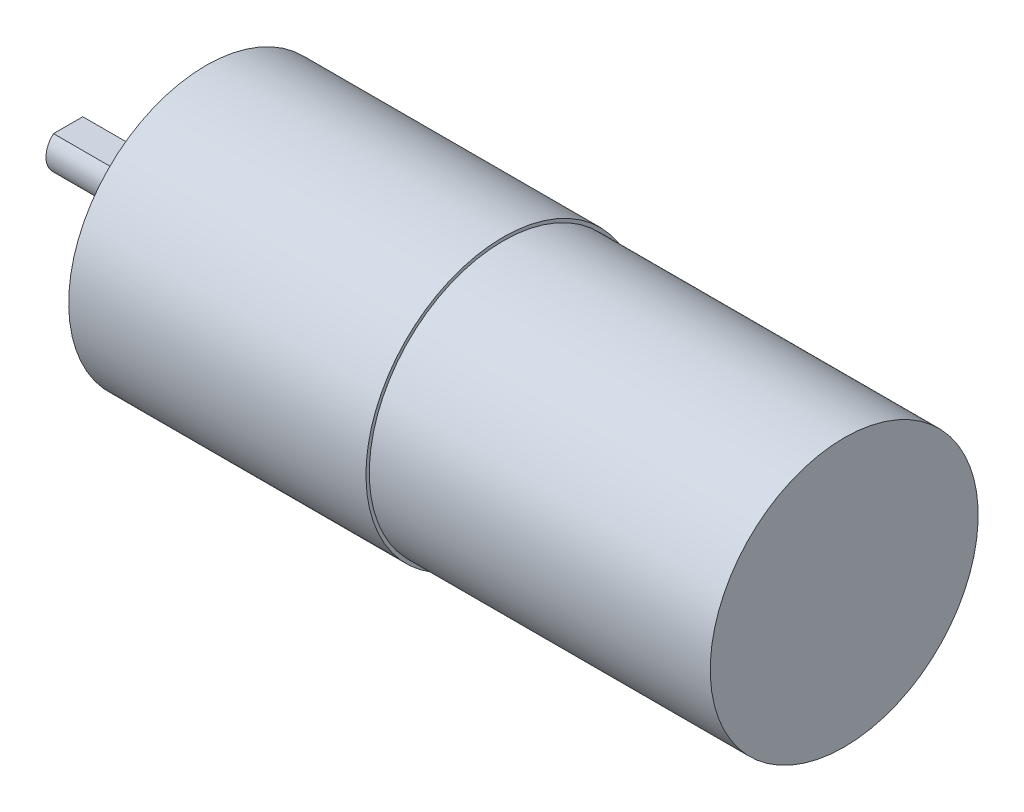
ISO-10303-21;
HEADER;
FILE_DESCRIPTION(('STEP AP214'),'2;1');
FILE_NAME('part.step','',(''),(''),'','','');
FILE_SCHEMA(('AUTOMOTIVE_DESIGN { 1 0 10303 214 1 1 1 1 }'));
ENDSEC;
DATA;
#1=APPLICATION_CONTEXT('core data for automotive mechanical design processes');
#2=APPLICATION_PROTOCOL_DEFINITION('international standard','automotive_design',2000,#1);
#3=PRODUCT_CONTEXT('',#1,'mechanical');
#4=PRODUCT('Part','Part','',(#3));
#5=PRODUCT_RELATED_PRODUCT_CATEGORY('part','',(#4));
#6=PRODUCT_DEFINITION_FORMATION('','',#4);
#7=PRODUCT_DEFINITION_CONTEXT('part definition',#1,'design');
#8=PRODUCT_DEFINITION('design','',#6,#7);
#9=PRODUCT_DEFINITION_SHAPE('','',#8);
#10=(LENGTH_UNIT() NAMED_UNIT(*) SI_UNIT(.MILLI.,.METRE.));
#11=(NAMED_UNIT(*) PLANE_ANGLE_UNIT() SI_UNIT($,.RADIAN.));
#12=(NAMED_UNIT(*) SI_UNIT($,.STERADIAN.) SOLID_ANGLE_UNIT());
#13=UNCERTAINTY_MEASURE_WITH_UNIT(LENGTH_MEASURE(1.E-05),#10,'distance_accuracy_value','');
#14=(GEOMETRIC_REPRESENTATION_CONTEXT(3) GLOBAL_UNCERTAINTY_ASSIGNED_CONTEXT((#13)) GLOBAL_UNIT_ASSIGNED_CONTEXT((#10,
#11,#12)) REPRESENTATION_CONTEXT('',''));
#15=CARTESIAN_POINT('',(0.,0.,0.));
#16=DIRECTION('',(0.,0.,1.));
#17=DIRECTION('',(1.,0.,0.));
#18=AXIS2_PLACEMENT_3D('',#15,#16,#17);
#19=CARTESIAN_POINT('',(-54.7,0.,0.));
#20=DIRECTION('',(-1.,0.,0.));
#21=DIRECTION('',(0.,-1.,0.));
#22=AXIS2_PLACEMENT_3D('',#19,#20,#21);
#23=PLANE('',#22);
#24=DIRECTION('',(0.,0.,1.));
#25=VECTOR('',#24,1.);
#26=CARTESIAN_POINT('',(-54.7,1.5,-1.3228756555323));
#27=LINE('',#26,#25);
#28=CARTESIAN_POINT('',(-54.7,1.5,-1.3228756555323));
#29=VERTEX_POINT('',#28);
#30=CARTESIAN_POINT('',(-54.7,1.5,1.3228756555323));
#31=VERTEX_POINT('',#30);
#32=EDGE_CURVE('E62',#29,#31,#27,.T.);
#33=ORIENTED_EDGE('',*,*,#32,.F.);
#34=CARTESIAN_POINT('',(-54.7,0.,0.));
#35=DIRECTION('',(1.,0.,0.));
#36=DIRECTION('',(0.,1.,0.));
#37=AXIS2_PLACEMENT_3D('',#34,#35,#36);
#38=CIRCLE('',#37,2.);
#39=EDGE_CURVE('E11',#31,#29,#38,.T.);
#40=ORIENTED_EDGE('',*,*,#39,.F.);
#41=EDGE_LOOP('',(#33,#40));
#42=FACE_BOUND('',#41,.T.);
#43=ADVANCED_FACE('F34',(#42),#23,.T.);
#44=CARTESIAN_POINT('',(-28.825,0.,0.));
#45=DIRECTION('',(1.,0.,0.));
#46=DIRECTION('',(0.,1.,0.));
#47=AXIS2_PLACEMENT_3D('',#44,#45,#46);
#48=CYLINDRICAL_SURFACE('',#47,2.);
#49=DIRECTION('',(-1.,0.,0.));
#50=VECTOR('',#49,1.);
#51=CARTESIAN_POINT('',(-46.7,1.5,-1.3228756555323));
#52=LINE('',#51,#50);
#53=CARTESIAN_POINT('',(-46.7,1.5,-1.3228756555323));
#54=VERTEX_POINT('',#53);
#55=EDGE_CURVE('E59',#54,#29,#52,.T.);
#56=ORIENTED_EDGE('',*,*,#55,.F.);
#57=CARTESIAN_POINT('',(-46.7,0.,0.));
#58=DIRECTION('',(-1.,0.,0.));
#59=DIRECTION('',(0.,-1.,0.));
#60=AXIS2_PLACEMENT_3D('',#57,#58,#59);
#61=CIRCLE('',#60,2.);
#62=CARTESIAN_POINT('',(-46.7,1.5,1.3228756555323));
#63=VERTEX_POINT('',#62);
#64=EDGE_CURVE('E52',#63,#54,#61,.T.);
#65=ORIENTED_EDGE('',*,*,#64,.F.);
#66=DIRECTION('',(-1.,0.,0.));
#67=VECTOR('',#66,1.);
#68=CARTESIAN_POINT('',(-46.7,1.5,1.3228756555323));
#69=LINE('',#68,#67);
#70=EDGE_CURVE('E65',#63,#31,#69,.T.);
#71=ORIENTED_EDGE('',*,*,#70,.T.);
#72=ORIENTED_EDGE('',*,*,#39,.T.);
#73=EDGE_LOOP('',(#56,#65,#71,#72));
#74=FACE_BOUND('',#73,.T.);
#75=CARTESIAN_POINT('',(-44.8,0.,0.));
#76=DIRECTION('',(1.,0.,0.));
#77=DIRECTION('',(0.,1.,0.));
#78=AXIS2_PLACEMENT_3D('',#75,#76,#77);
#79=CIRCLE('',#78,2.);
#80=CARTESIAN_POINT('',(-44.8,2.,0.));
#81=VERTEX_POINT('',#80);
#82=EDGE_CURVE('E41',#81,#81,#79,.T.);
#83=ORIENTED_EDGE('',*,*,#82,.F.);
#84=EDGE_LOOP('',(#83));
#85=FACE_BOUND('',#84,.T.);
#86=ADVANCED_FACE('F70',(#74,#85),#48,.T.);
#87=CARTESIAN_POINT('',(-44.8,2.,0.));
#88=DIRECTION('',(-1.,0.,0.));
#89=DIRECTION('',(0.,-1.,0.));
#90=AXIS2_PLACEMENT_3D('',#87,#88,#89);
#91=PLANE('',#90);
#92=ORIENTED_EDGE('',*,*,#82,.T.);
#93=EDGE_LOOP('',(#92));
#94=FACE_BOUND('',#93,.T.);
#95=CARTESIAN_POINT('',(-44.8,0.,0.));
#96=DIRECTION('',(1.,0.,0.));
#97=DIRECTION('',(0.,1.,0.));
#98=AXIS2_PLACEMENT_3D('',#95,#96,#97);
#99=CIRCLE('',#98,3.475);
#100=CARTESIAN_POINT('',(-44.8,3.475,0.));
#101=VERTEX_POINT('',#100);
#102=EDGE_CURVE('E90',#101,#101,#99,.T.);
#103=ORIENTED_EDGE('',*,*,#102,.F.);
#104=EDGE_LOOP('',(#103));
#105=FACE_BOUND('',#104,.T.);
#106=ADVANCED_FACE('F95',(#94,#105),#91,.T.);
#107=CARTESIAN_POINT('',(-28.825,0.,0.));
#108=DIRECTION('',(1.,0.,0.));
#109=DIRECTION('',(0.,1.,0.));
#110=AXIS2_PLACEMENT_3D('',#107,#108,#109);
#111=CYLINDRICAL_SURFACE('',#110,3.475);
#112=ORIENTED_EDGE('',*,*,#102,.T.);
#113=EDGE_LOOP('',(#112));
#114=FACE_BOUND('',#113,.T.);
#115=CARTESIAN_POINT('',(-42.25,0.,0.));
#116=DIRECTION('',(1.,0.,0.));
#117=DIRECTION('',(0.,1.,0.));
#118=AXIS2_PLACEMENT_3D('',#115,#116,#117);
#119=CIRCLE('',#118,3.475);
#120=CARTESIAN_POINT('',(-42.25,3.475,0.));
#121=VERTEX_POINT('',#120);
#122=EDGE_CURVE('E87',#121,#121,#119,.T.);
#123=ORIENTED_EDGE('',*,*,#122,.F.);
#124=EDGE_LOOP('',(#123));
#125=FACE_BOUND('',#124,.T.);
#126=ADVANCED_FACE('F102',(#114,#125),#111,.T.);
#127=CARTESIAN_POINT('',(-42.25,3.475,0.));
#128=DIRECTION('',(-1.,0.,0.));
#129=DIRECTION('',(0.,-1.,0.));
#130=AXIS2_PLACEMENT_3D('',#127,#128,#129);
#131=PLANE('',#130);
#132=ORIENTED_EDGE('',*,*,#122,.T.);
#133=EDGE_LOOP('',(#132));
#134=FACE_BOUND('',#133,.T.);
#135=CARTESIAN_POINT('',(-42.25,0.,0.));
#136=DIRECTION('',(1.,0.,0.));
#137=DIRECTION('',(0.,1.,0.));
#138=AXIS2_PLACEMENT_3D('',#135,#136,#137);
#139=CIRCLE('',#138,12.3999999999999);
#140=CARTESIAN_POINT('',(-42.25,12.3999999999999,0.));
#141=VERTEX_POINT('',#140);
#142=EDGE_CURVE('E84',#141,#141,#139,.T.);
#143=ORIENTED_EDGE('',*,*,#142,.F.);
#144=EDGE_LOOP('',(#143));
#145=FACE_BOUND('',#144,.T.);
#146=ADVANCED_FACE('F107',(#134,#145),#131,.T.);
#147=CARTESIAN_POINT('',(-28.825,0.,0.));
#148=DIRECTION('',(1.,0.,0.));
#149=DIRECTION('',(0.,1.,0.));
#150=AXIS2_PLACEMENT_3D('',#147,#148,#149);
#151=CYLINDRICAL_SURFACE('',#150,12.3999999999999);
#152=ORIENTED_EDGE('',*,*,#142,.T.);
#153=EDGE_LOOP('',(#152));
#154=FACE_BOUND('',#153,.T.);
#155=CARTESIAN_POINT('',(-15.4,0.,0.));
#156=DIRECTION('',(1.,0.,0.));
#157=DIRECTION('',(0.,1.,0.));
#158=AXIS2_PLACEMENT_3D('',#155,#156,#157);
#159=CIRCLE('',#158,12.3999999999999);
#160=CARTESIAN_POINT('',(-15.4,12.3999999999999,0.));
#161=VERTEX_POINT('',#160);
#162=EDGE_CURVE('E81',#161,#161,#159,.T.);
#163=ORIENTED_EDGE('',*,*,#162,.F.);
#164=EDGE_LOOP('',(#163));
#165=FACE_BOUND('',#164,.T.);
#166=ADVANCED_FACE('F111',(#154,#165),#151,.T.);
#167=CARTESIAN_POINT('',(-15.4,12.3999999999999,0.));
#168=DIRECTION('',(1.,0.,0.));
#169=DIRECTION('',(0.,1.,0.));
#170=AXIS2_PLACEMENT_3D('',#167,#168,#169);
#171=PLANE('',#170);
#172=ORIENTED_EDGE('',*,*,#162,.T.);
#173=EDGE_LOOP('',(#172));
#174=FACE_BOUND('',#173,.T.);
#175=CARTESIAN_POINT('',(-15.4,0.,0.));
#176=DIRECTION('',(1.,0.,0.));
#177=DIRECTION('',(0.,1.,0.));
#178=AXIS2_PLACEMENT_3D('',#175,#176,#177);
#179=CIRCLE('',#178,12.1);
#180=CARTESIAN_POINT('',(-15.4,12.1,0.));
#181=VERTEX_POINT('',#180);
#182=EDGE_CURVE('E75',#181,#181,#179,.T.);
#183=ORIENTED_EDGE('',*,*,#182,.F.);
#184=EDGE_LOOP('',(#183));
#185=FACE_BOUND('',#184,.T.);
#186=ADVANCED_FACE('F115',(#174,#185),#171,.T.);
#187=CARTESIAN_POINT('',(-28.825,0.,0.));
#188=DIRECTION('',(1.,0.,0.));
#189=DIRECTION('',(0.,1.,0.));
#190=AXIS2_PLACEMENT_3D('',#187,#188,#189);
#191=CYLINDRICAL_SURFACE('',#190,12.1);
#192=ORIENTED_EDGE('',*,*,#182,.T.);
#193=EDGE_LOOP('',(#192));
#194=FACE_BOUND('',#193,.T.);
#195=CARTESIAN_POINT('',(15.4,0.,0.));
#196=DIRECTION('',(1.,0.,0.));
#197=DIRECTION('',(0.,1.,0.));
#198=AXIS2_PLACEMENT_3D('',#195,#196,#197);
#199=CIRCLE('',#198,12.1);
#200=CARTESIAN_POINT('',(15.4,12.1,0.));
#201=VERTEX_POINT('',#200);
#202=EDGE_CURVE('E72',#201,#201,#199,.T.);
#203=ORIENTED_EDGE('',*,*,#202,.F.);
#204=EDGE_LOOP('',(#203));
#205=FACE_BOUND('',#204,.T.);
#206=ADVANCED_FACE('F119',(#194,#205),#191,.T.);
#207=CARTESIAN_POINT('',(15.4,12.1,0.));
#208=DIRECTION('',(1.,0.,0.));
#209=DIRECTION('',(0.,1.,0.));
#210=AXIS2_PLACEMENT_3D('',#207,#208,#209);
#211=PLANE('',#210);
#212=ORIENTED_EDGE('',*,*,#202,.T.);
#213=EDGE_LOOP('',(#212));
#214=FACE_BOUND('',#213,.T.);
#215=ADVANCED_FACE('F123',(#214),#211,.T.);
#216=CARTESIAN_POINT('',(-46.7,1.5,-1.3228756555323));
#217=DIRECTION('',(0.,-1.,0.));
#218=DIRECTION('',(1.,0.,0.));
#219=AXIS2_PLACEMENT_3D('',#216,#217,#218);
#220=PLANE('',#219);
#221=ORIENTED_EDGE('',*,*,#32,.T.);
#222=ORIENTED_EDGE('',*,*,#70,.F.);
#223=DIRECTION('',(0.,0.,1.));
#224=VECTOR('',#223,1.);
#225=CARTESIAN_POINT('',(-46.7,1.5,-1.3228756555323));
#226=LINE('',#225,#224);
#227=EDGE_CURVE('E47',#54,#63,#226,.T.);
#228=ORIENTED_EDGE('',*,*,#227,.F.);
#229=ORIENTED_EDGE('',*,*,#55,.T.);
#230=EDGE_LOOP('',(#221,#222,#228,#229));
#231=FACE_BOUND('',#230,.T.);
#232=ADVANCED_FACE('F61',(#231),#220,.F.);
#233=CARTESIAN_POINT('',(-46.7,0.,0.));
#234=DIRECTION('',(-1.,0.,0.));
#235=DIRECTION('',(0.,-1.,0.));
#236=AXIS2_PLACEMENT_3D('',#233,#234,#235);
#237=PLANE('',#236);
#238=ORIENTED_EDGE('',*,*,#64,.T.);
#239=ORIENTED_EDGE('',*,*,#227,.T.);
#240=EDGE_LOOP('',(#238,#239));
#241=FACE_BOUND('',#240,.T.);
#242=ADVANCED_FACE('F130',(#241),#237,.T.);
#243=CLOSED_SHELL('',(#43,#86,#106,#126,#146,#166,#186,#206,#215,#232,#242));
#244=MANIFOLD_SOLID_BREP('B2',#243);
#245=ADVANCED_BREP_SHAPE_REPRESENTATION('',(#18,#244),#14);
#246=SHAPE_DEFINITION_REPRESENTATION(#9,#245);
ENDSEC;
END-ISO-10303-21;
